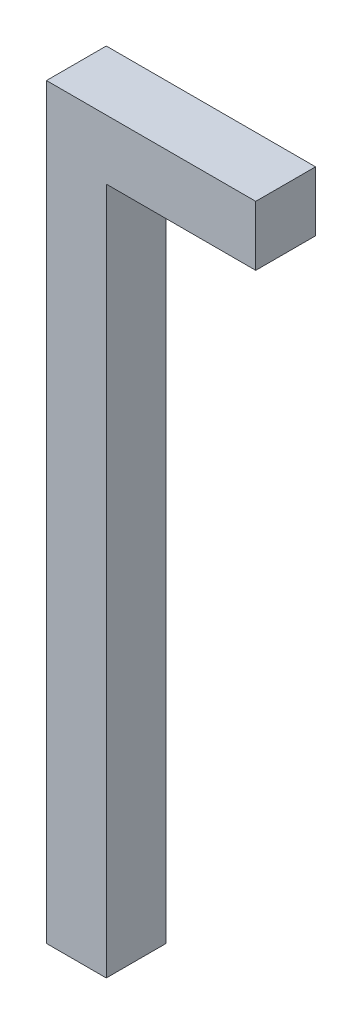
ISO-10303-21;
HEADER;
FILE_DESCRIPTION(('STEP AP214'),'2;1');
FILE_NAME('part.step','',(''),(''),'','','');
FILE_SCHEMA(('AUTOMOTIVE_DESIGN { 1 0 10303 214 1 1 1 1 }'));
ENDSEC;
DATA;
#1=APPLICATION_CONTEXT('core data for automotive mechanical design processes');
#2=APPLICATION_PROTOCOL_DEFINITION('international standard','automotive_design',2000,#1);
#3=PRODUCT_CONTEXT('',#1,'mechanical');
#4=PRODUCT('Part','Part','',(#3));
#5=PRODUCT_RELATED_PRODUCT_CATEGORY('part','',(#4));
#6=PRODUCT_DEFINITION_FORMATION('','',#4);
#7=PRODUCT_DEFINITION_CONTEXT('part definition',#1,'design');
#8=PRODUCT_DEFINITION('design','',#6,#7);
#9=PRODUCT_DEFINITION_SHAPE('','',#8);
#10=(LENGTH_UNIT() NAMED_UNIT(*) SI_UNIT(.MILLI.,.METRE.));
#11=(NAMED_UNIT(*) PLANE_ANGLE_UNIT() SI_UNIT($,.RADIAN.));
#12=(NAMED_UNIT(*) SI_UNIT($,.STERADIAN.) SOLID_ANGLE_UNIT());
#13=UNCERTAINTY_MEASURE_WITH_UNIT(LENGTH_MEASURE(1.E-05),#10,'distance_accuracy_value','');
#14=(GEOMETRIC_REPRESENTATION_CONTEXT(3) GLOBAL_UNCERTAINTY_ASSIGNED_CONTEXT((#13)) GLOBAL_UNIT_ASSIGNED_CONTEXT((#10,
#11,#12)) REPRESENTATION_CONTEXT('',''));
#15=CARTESIAN_POINT('',(0.,0.,0.));
#16=DIRECTION('',(0.,0.,1.));
#17=DIRECTION('',(1.,0.,0.));
#18=AXIS2_PLACEMENT_3D('',#15,#16,#17);
#19=CARTESIAN_POINT('',(80.,28.2842712474619,-75.1));
#20=DIRECTION('',(-1.,0.,0.));
#21=DIRECTION('',(0.,0.,1.));
#22=AXIS2_PLACEMENT_3D('',#19,#20,#21);
#23=PLANE('',#22);
#24=DIRECTION('',(0.,0.,-1.));
#25=VECTOR('',#24,1.);
#26=CARTESIAN_POINT('',(80.,-20.,-55.1));
#27=LINE('',#26,#25);
#28=CARTESIAN_POINT('',(80.,-20.,-55.1));
#29=VERTEX_POINT('',#28);
#30=CARTESIAN_POINT('',(80.,-20.,-75.1));
#31=VERTEX_POINT('',#30);
#32=EDGE_CURVE('E60',#29,#31,#27,.T.);
#33=ORIENTED_EDGE('',*,*,#32,.F.);
#34=DIRECTION('',(0.,-1.,0.));
#35=VECTOR('',#34,1.);
#36=CARTESIAN_POINT('',(80.,28.2842712474619,-55.1));
#37=LINE('',#36,#35);
#38=CARTESIAN_POINT('',(80.,-250.,-55.1));
#39=VERTEX_POINT('',#38);
#40=EDGE_CURVE('E47',#29,#39,#37,.T.);
#41=ORIENTED_EDGE('',*,*,#40,.T.);
#42=DIRECTION('',(0.,0.,-1.));
#43=VECTOR('',#42,1.);
#44=CARTESIAN_POINT('',(80.,-250.,-75.1));
#45=LINE('',#44,#43);
#46=CARTESIAN_POINT('',(80.,-250.,-75.1));
#47=VERTEX_POINT('',#46);
#48=EDGE_CURVE('E141',#39,#47,#45,.T.);
#49=ORIENTED_EDGE('',*,*,#48,.T.);
#50=DIRECTION('',(0.,-1.,0.));
#51=VECTOR('',#50,1.);
#52=CARTESIAN_POINT('',(80.,28.2842712474619,-75.1));
#53=LINE('',#52,#51);
#54=EDGE_CURVE('E84',#31,#47,#53,.T.);
#55=ORIENTED_EDGE('',*,*,#54,.F.);
#56=EDGE_LOOP('',(#33,#41,#49,#55));
#57=FACE_BOUND('',#56,.T.);
#58=ADVANCED_FACE('F43',(#57),#23,.F.);
#59=CARTESIAN_POINT('',(60.,28.2842712474619,-75.1));
#60=DIRECTION('',(0.,0.,1.));
#61=DIRECTION('',(1.,0.,0.));
#62=AXIS2_PLACEMENT_3D('',#59,#60,#61);
#63=PLANE('',#62);
#64=DIRECTION('',(-1.,0.,0.));
#65=VECTOR('',#64,1.);
#66=CARTESIAN_POINT('',(60.,0.,-75.1));
#67=LINE('',#66,#65);
#68=CARTESIAN_POINT('',(130.,0.,-75.1));
#69=VERTEX_POINT('',#68);
#70=CARTESIAN_POINT('',(60.,0.,-75.1));
#71=VERTEX_POINT('',#70);
#72=EDGE_CURVE('E52',#69,#71,#67,.T.);
#73=ORIENTED_EDGE('',*,*,#72,.F.);
#74=DIRECTION('',(0.,1.,0.));
#75=VECTOR('',#74,1.);
#76=CARTESIAN_POINT('',(130.,0.,-75.1));
#77=LINE('',#76,#75);
#78=CARTESIAN_POINT('',(130.,-20.,-75.1));
#79=VERTEX_POINT('',#78);
#80=EDGE_CURVE('E115',#79,#69,#77,.T.);
#81=ORIENTED_EDGE('',*,*,#80,.F.);
#82=DIRECTION('',(-1.,0.,0.));
#83=VECTOR('',#82,1.);
#84=CARTESIAN_POINT('',(130.,-20.,-75.1));
#85=LINE('',#84,#83);
#86=EDGE_CURVE('E120',#79,#31,#85,.T.);
#87=ORIENTED_EDGE('',*,*,#86,.T.);
#88=ORIENTED_EDGE('',*,*,#54,.T.);
#89=DIRECTION('',(-1.,0.,0.));
#90=VECTOR('',#89,1.);
#91=CARTESIAN_POINT('',(60.,-250.,-75.1));
#92=LINE('',#91,#90);
#93=CARTESIAN_POINT('',(60.,-250.,-75.1));
#94=VERTEX_POINT('',#93);
#95=EDGE_CURVE('E139',#47,#94,#92,.T.);
#96=ORIENTED_EDGE('',*,*,#95,.T.);
#97=DIRECTION('',(0.,-1.,0.));
#98=VECTOR('',#97,1.);
#99=CARTESIAN_POINT('',(60.,28.2842712474619,-75.1));
#100=LINE('',#99,#98);
#101=EDGE_CURVE('E138',#71,#94,#100,.T.);
#102=ORIENTED_EDGE('',*,*,#101,.F.);
#103=EDGE_LOOP('',(#73,#81,#87,#88,#96,#102));
#104=FACE_BOUND('',#103,.T.);
#105=ADVANCED_FACE('F125',(#104),#63,.F.);
#106=CARTESIAN_POINT('',(60.,28.2842712474619,-75.1));
#107=DIRECTION('',(1.,0.,0.));
#108=DIRECTION('',(0.,0.,-1.));
#109=AXIS2_PLACEMENT_3D('',#106,#107,#108);
#110=PLANE('',#109);
#111=DIRECTION('',(0.,0.,1.));
#112=VECTOR('',#111,1.);
#113=CARTESIAN_POINT('',(60.,0.,-75.1));
#114=LINE('',#113,#112);
#115=CARTESIAN_POINT('',(60.,0.,-55.1));
#116=VERTEX_POINT('',#115);
#117=EDGE_CURVE('E11',#71,#116,#114,.T.);
#118=ORIENTED_EDGE('',*,*,#117,.F.);
#119=ORIENTED_EDGE('',*,*,#101,.T.);
#120=DIRECTION('',(0.,0.,1.));
#121=VECTOR('',#120,1.);
#122=CARTESIAN_POINT('',(60.,-250.,-75.1));
#123=LINE('',#122,#121);
#124=CARTESIAN_POINT('',(60.,-250.,-55.1));
#125=VERTEX_POINT('',#124);
#126=EDGE_CURVE('E136',#94,#125,#123,.T.);
#127=ORIENTED_EDGE('',*,*,#126,.T.);
#128=DIRECTION('',(0.,-1.,0.));
#129=VECTOR('',#128,1.);
#130=CARTESIAN_POINT('',(60.,28.2842712474619,-55.1));
#131=LINE('',#130,#129);
#132=EDGE_CURVE('E69',#116,#125,#131,.T.);
#133=ORIENTED_EDGE('',*,*,#132,.F.);
#134=EDGE_LOOP('',(#118,#119,#127,#133));
#135=FACE_BOUND('',#134,.T.);
#136=ADVANCED_FACE('F147',(#135),#110,.F.);
#137=CARTESIAN_POINT('',(60.,28.2842712474619,-55.1));
#138=DIRECTION('',(0.,0.,-1.));
#139=DIRECTION('',(-1.,0.,0.));
#140=AXIS2_PLACEMENT_3D('',#137,#138,#139);
#141=PLANE('',#140);
#142=DIRECTION('',(1.,0.,0.));
#143=VECTOR('',#142,1.);
#144=CARTESIAN_POINT('',(60.,0.,-55.1));
#145=LINE('',#144,#143);
#146=CARTESIAN_POINT('',(130.,0.,-55.1));
#147=VERTEX_POINT('',#146);
#148=EDGE_CURVE('E94',#116,#147,#145,.T.);
#149=ORIENTED_EDGE('',*,*,#148,.F.);
#150=ORIENTED_EDGE('',*,*,#132,.T.);
#151=DIRECTION('',(1.,0.,0.));
#152=VECTOR('',#151,1.);
#153=CARTESIAN_POINT('',(60.,-250.,-55.1));
#154=LINE('',#153,#152);
#155=EDGE_CURVE('E134',#125,#39,#154,.T.);
#156=ORIENTED_EDGE('',*,*,#155,.T.);
#157=ORIENTED_EDGE('',*,*,#40,.F.);
#158=DIRECTION('',(-1.,0.,0.));
#159=VECTOR('',#158,1.);
#160=CARTESIAN_POINT('',(130.,-20.,-55.1));
#161=LINE('',#160,#159);
#162=CARTESIAN_POINT('',(130.,-20.,-55.1));
#163=VERTEX_POINT('',#162);
#164=EDGE_CURVE('E122',#163,#29,#161,.T.);
#165=ORIENTED_EDGE('',*,*,#164,.F.);
#166=DIRECTION('',(0.,-1.,0.));
#167=VECTOR('',#166,1.);
#168=CARTESIAN_POINT('',(130.,-20.,-55.1));
#169=LINE('',#168,#167);
#170=EDGE_CURVE('E117',#147,#163,#169,.T.);
#171=ORIENTED_EDGE('',*,*,#170,.F.);
#172=EDGE_LOOP('',(#149,#150,#156,#157,#165,#171));
#173=FACE_BOUND('',#172,.T.);
#174=ADVANCED_FACE('F153',(#173),#141,.F.);
#175=CARTESIAN_POINT('',(0.,-250.,0.));
#176=DIRECTION('',(0.,1.,0.));
#177=DIRECTION('',(0.,0.,1.));
#178=AXIS2_PLACEMENT_3D('',#175,#176,#177);
#179=PLANE('',#178);
#180=ORIENTED_EDGE('',*,*,#48,.F.);
#181=ORIENTED_EDGE('',*,*,#155,.F.);
#182=ORIENTED_EDGE('',*,*,#126,.F.);
#183=ORIENTED_EDGE('',*,*,#95,.F.);
#184=EDGE_LOOP('',(#180,#181,#182,#183));
#185=FACE_BOUND('',#184,.T.);
#186=ADVANCED_FACE('F152',(#185),#179,.F.);
#187=CARTESIAN_POINT('',(166.2,0.,236.));
#188=DIRECTION('',(0.,1.,0.));
#189=DIRECTION('',(-1.,0.,0.));
#190=AXIS2_PLACEMENT_3D('',#187,#188,#189);
#191=PLANE('',#190);
#192=ORIENTED_EDGE('',*,*,#148,.T.);
#193=DIRECTION('',(0.,0.,1.));
#194=VECTOR('',#193,1.);
#195=CARTESIAN_POINT('',(130.,0.,-55.1));
#196=LINE('',#195,#194);
#197=EDGE_CURVE('E123',#69,#147,#196,.T.);
#198=ORIENTED_EDGE('',*,*,#197,.F.);
#199=ORIENTED_EDGE('',*,*,#72,.T.);
#200=ORIENTED_EDGE('',*,*,#117,.T.);
#201=EDGE_LOOP('',(#192,#198,#199,#200));
#202=FACE_BOUND('',#201,.T.);
#203=ADVANCED_FACE('F45',(#202),#191,.T.);
#204=CARTESIAN_POINT('',(130.,-20.,-55.1));
#205=DIRECTION('',(0.,1.,0.));
#206=DIRECTION('',(0.,0.,1.));
#207=AXIS2_PLACEMENT_3D('',#204,#205,#206);
#208=PLANE('',#207);
#209=ORIENTED_EDGE('',*,*,#32,.T.);
#210=ORIENTED_EDGE('',*,*,#86,.F.);
#211=DIRECTION('',(0.,0.,-1.));
#212=VECTOR('',#211,1.);
#213=CARTESIAN_POINT('',(130.,-20.,-55.1));
#214=LINE('',#213,#212);
#215=EDGE_CURVE('E109',#163,#79,#214,.T.);
#216=ORIENTED_EDGE('',*,*,#215,.F.);
#217=ORIENTED_EDGE('',*,*,#164,.T.);
#218=EDGE_LOOP('',(#209,#210,#216,#217));
#219=FACE_BOUND('',#218,.T.);
#220=ADVANCED_FACE('F121',(#219),#208,.F.);
#221=CARTESIAN_POINT('',(130.,0.,0.));
#222=DIRECTION('',(-1.,0.,0.));
#223=DIRECTION('',(0.,0.,1.));
#224=AXIS2_PLACEMENT_3D('',#221,#222,#223);
#225=PLANE('',#224);
#226=ORIENTED_EDGE('',*,*,#170,.T.);
#227=ORIENTED_EDGE('',*,*,#215,.T.);
#228=ORIENTED_EDGE('',*,*,#80,.T.);
#229=ORIENTED_EDGE('',*,*,#197,.T.);
#230=EDGE_LOOP('',(#226,#227,#228,#229));
#231=FACE_BOUND('',#230,.T.);
#232=ADVANCED_FACE('F113',(#231),#225,.F.);
#233=CLOSED_SHELL('',(#58,#105,#136,#174,#186,#203,#220,#232));
#234=MANIFOLD_SOLID_BREP('B2',#233);
#235=ADVANCED_BREP_SHAPE_REPRESENTATION('',(#18,#234),#14);
#236=SHAPE_DEFINITION_REPRESENTATION(#9,#235);
ENDSEC;
END-ISO-10303-21;
